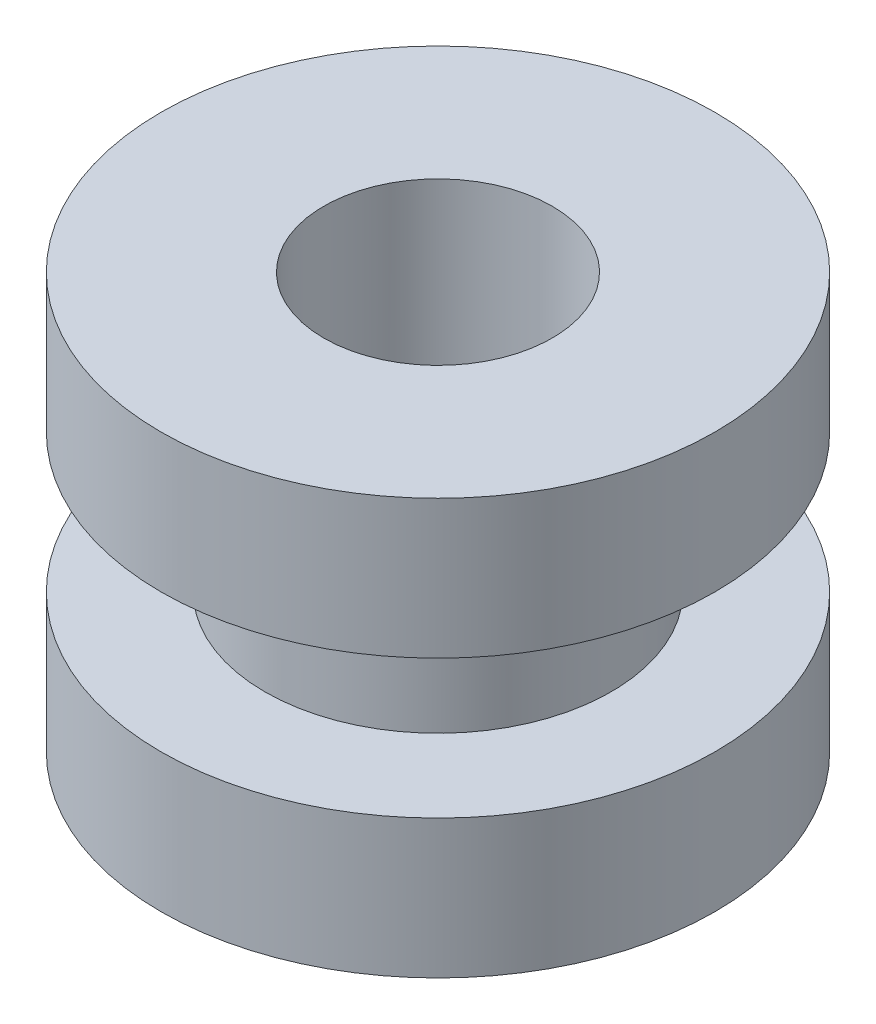
ISO-10303-21;
HEADER;
FILE_DESCRIPTION(('STEP AP214'),'2;1');
FILE_NAME('part.step','',(''),(''),'','','');
FILE_SCHEMA(('AUTOMOTIVE_DESIGN { 1 0 10303 214 1 1 1 1 }'));
ENDSEC;
DATA;
#1=APPLICATION_CONTEXT('core data for automotive mechanical design processes');
#2=APPLICATION_PROTOCOL_DEFINITION('international standard','automotive_design',2000,#1);
#3=PRODUCT_CONTEXT('',#1,'mechanical');
#4=PRODUCT('Part','Part','',(#3));
#5=PRODUCT_RELATED_PRODUCT_CATEGORY('part','',(#4));
#6=PRODUCT_DEFINITION_FORMATION('','',#4);
#7=PRODUCT_DEFINITION_CONTEXT('part definition',#1,'design');
#8=PRODUCT_DEFINITION('design','',#6,#7);
#9=PRODUCT_DEFINITION_SHAPE('','',#8);
#10=(LENGTH_UNIT() NAMED_UNIT(*) SI_UNIT(.MILLI.,.METRE.));
#11=(NAMED_UNIT(*) PLANE_ANGLE_UNIT() SI_UNIT($,.RADIAN.));
#12=(NAMED_UNIT(*) SI_UNIT($,.STERADIAN.) SOLID_ANGLE_UNIT());
#13=UNCERTAINTY_MEASURE_WITH_UNIT(LENGTH_MEASURE(1.E-05),#10,'distance_accuracy_value','');
#14=(GEOMETRIC_REPRESENTATION_CONTEXT(3) GLOBAL_UNCERTAINTY_ASSIGNED_CONTEXT((#13)) GLOBAL_UNIT_ASSIGNED_CONTEXT((#10,
#11,#12)) REPRESENTATION_CONTEXT('',''));
#15=CARTESIAN_POINT('',(0.,0.,0.));
#16=DIRECTION('',(0.,0.,1.));
#17=DIRECTION('',(1.,0.,0.));
#18=AXIS2_PLACEMENT_3D('',#15,#16,#17);
#19=CARTESIAN_POINT('',(0.,-6.,0.));
#20=DIRECTION('',(0.,-1.,0.));
#21=DIRECTION('',(0.,0.,-1.));
#22=AXIS2_PLACEMENT_3D('',#19,#20,#21);
#23=PLANE('',#22);
#24=CARTESIAN_POINT('',(0.,-6.,0.));
#25=DIRECTION('',(0.,-1.,0.));
#26=DIRECTION('',(0.,0.,-1.));
#27=AXIS2_PLACEMENT_3D('',#24,#25,#26);
#28=CIRCLE('',#27,6.3);
#29=CARTESIAN_POINT('',(0.,-6.,-6.3));
#30=VERTEX_POINT('',#29);
#31=EDGE_CURVE('E62',#30,#30,#28,.T.);
#32=ORIENTED_EDGE('',*,*,#31,.F.);
#33=EDGE_LOOP('',(#32));
#34=FACE_BOUND('',#33,.T.);
#35=CARTESIAN_POINT('',(0.,-6.,0.));
#36=DIRECTION('',(0.,1.,0.));
#37=DIRECTION('',(0.,0.,1.));
#38=AXIS2_PLACEMENT_3D('',#35,#36,#37);
#39=CIRCLE('',#38,8.);
#40=CARTESIAN_POINT('',(0.,-6.,8.));
#41=VERTEX_POINT('',#40);
#42=EDGE_CURVE('E10',#41,#41,#39,.T.);
#43=ORIENTED_EDGE('',*,*,#42,.F.);
#44=EDGE_LOOP('',(#43));
#45=FACE_BOUND('',#44,.T.);
#46=ADVANCED_FACE('F31',(#34,#45),#23,.T.);
#47=CARTESIAN_POINT('',(0.,0.,0.));
#48=DIRECTION('',(0.,1.,0.));
#49=DIRECTION('',(0.,0.,1.));
#50=AXIS2_PLACEMENT_3D('',#47,#48,#49);
#51=CYLINDRICAL_SURFACE('',#50,8.);
#52=ORIENTED_EDGE('',*,*,#42,.T.);
#53=EDGE_LOOP('',(#52));
#54=FACE_BOUND('',#53,.T.);
#55=CARTESIAN_POINT('',(0.,-2.,0.));
#56=DIRECTION('',(0.,1.,0.));
#57=DIRECTION('',(0.,0.,1.));
#58=AXIS2_PLACEMENT_3D('',#55,#56,#57);
#59=CIRCLE('',#58,8.);
#60=CARTESIAN_POINT('',(0.,-2.,8.));
#61=VERTEX_POINT('',#60);
#62=EDGE_CURVE('E37',#61,#61,#59,.T.);
#63=ORIENTED_EDGE('',*,*,#62,.F.);
#64=EDGE_LOOP('',(#63));
#65=FACE_BOUND('',#64,.T.);
#66=ADVANCED_FACE('F70',(#54,#65),#51,.T.);
#67=CARTESIAN_POINT('',(-8.,-2.,0.));
#68=DIRECTION('',(0.,1.,0.));
#69=DIRECTION('',(0.,0.,1.));
#70=AXIS2_PLACEMENT_3D('',#67,#68,#69);
#71=PLANE('',#70);
#72=ORIENTED_EDGE('',*,*,#62,.T.);
#73=EDGE_LOOP('',(#72));
#74=FACE_BOUND('',#73,.T.);
#75=CARTESIAN_POINT('',(0.,-2.,0.));
#76=DIRECTION('',(0.,1.,0.));
#77=DIRECTION('',(0.,0.,1.));
#78=AXIS2_PLACEMENT_3D('',#75,#76,#77);
#79=CIRCLE('',#78,5.);
#80=CARTESIAN_POINT('',(0.,-2.,5.));
#81=VERTEX_POINT('',#80);
#82=EDGE_CURVE('E41',#81,#81,#79,.T.);
#83=ORIENTED_EDGE('',*,*,#82,.F.);
#84=EDGE_LOOP('',(#83));
#85=FACE_BOUND('',#84,.T.);
#86=ADVANCED_FACE('F74',(#74,#85),#71,.T.);
#87=CARTESIAN_POINT('',(0.,0.,0.));
#88=DIRECTION('',(0.,1.,0.));
#89=DIRECTION('',(0.,0.,1.));
#90=AXIS2_PLACEMENT_3D('',#87,#88,#89);
#91=CYLINDRICAL_SURFACE('',#90,5.);
#92=ORIENTED_EDGE('',*,*,#82,.T.);
#93=EDGE_LOOP('',(#92));
#94=FACE_BOUND('',#93,.T.);
#95=CARTESIAN_POINT('',(0.,2.,0.));
#96=DIRECTION('',(0.,1.,0.));
#97=DIRECTION('',(0.,0.,1.));
#98=AXIS2_PLACEMENT_3D('',#95,#96,#97);
#99=CIRCLE('',#98,5.);
#100=CARTESIAN_POINT('',(0.,2.,5.));
#101=VERTEX_POINT('',#100);
#102=EDGE_CURVE('E53',#101,#101,#99,.T.);
#103=ORIENTED_EDGE('',*,*,#102,.F.);
#104=EDGE_LOOP('',(#103));
#105=FACE_BOUND('',#104,.T.);
#106=ADVANCED_FACE('F78',(#94,#105),#91,.T.);
#107=CARTESIAN_POINT('',(0.,6.,0.));
#108=DIRECTION('',(0.,1.,0.));
#109=DIRECTION('',(0.,0.,-1.));
#110=AXIS2_PLACEMENT_3D('',#107,#108,#109);
#111=PLANE('',#110);
#112=CARTESIAN_POINT('',(0.,6.,0.));
#113=DIRECTION('',(0.,1.,0.));
#114=DIRECTION('',(0.,0.,1.));
#115=AXIS2_PLACEMENT_3D('',#112,#113,#114);
#116=CIRCLE('',#115,3.3);
#117=CARTESIAN_POINT('',(0.,6.,3.3));
#118=VERTEX_POINT('',#117);
#119=EDGE_CURVE('E56',#118,#118,#116,.T.);
#120=ORIENTED_EDGE('',*,*,#119,.F.);
#121=EDGE_LOOP('',(#120));
#122=FACE_BOUND('',#121,.T.);
#123=CARTESIAN_POINT('',(0.,6.,0.));
#124=DIRECTION('',(0.,1.,0.));
#125=DIRECTION('',(0.,0.,1.));
#126=AXIS2_PLACEMENT_3D('',#123,#124,#125);
#127=CIRCLE('',#126,8.);
#128=CARTESIAN_POINT('',(0.,6.,8.));
#129=VERTEX_POINT('',#128);
#130=EDGE_CURVE('E45',#129,#129,#127,.T.);
#131=ORIENTED_EDGE('',*,*,#130,.T.);
#132=EDGE_LOOP('',(#131));
#133=FACE_BOUND('',#132,.T.);
#134=ADVANCED_FACE('F84',(#122,#133),#111,.T.);
#135=CARTESIAN_POINT('',(0.,0.,0.));
#136=DIRECTION('',(0.,-1.,0.));
#137=DIRECTION('',(0.,0.,1.));
#138=AXIS2_PLACEMENT_3D('',#135,#136,#137);
#139=CYLINDRICAL_SURFACE('',#138,8.);
#140=ORIENTED_EDGE('',*,*,#130,.F.);
#141=EDGE_LOOP('',(#140));
#142=FACE_BOUND('',#141,.T.);
#143=CARTESIAN_POINT('',(0.,2.,0.));
#144=DIRECTION('',(0.,1.,0.));
#145=DIRECTION('',(0.,0.,1.));
#146=AXIS2_PLACEMENT_3D('',#143,#144,#145);
#147=CIRCLE('',#146,8.);
#148=CARTESIAN_POINT('',(0.,2.,8.));
#149=VERTEX_POINT('',#148);
#150=EDGE_CURVE('E50',#149,#149,#147,.T.);
#151=ORIENTED_EDGE('',*,*,#150,.T.);
#152=EDGE_LOOP('',(#151));
#153=FACE_BOUND('',#152,.T.);
#154=ADVANCED_FACE('F88',(#142,#153),#139,.T.);
#155=CARTESIAN_POINT('',(-8.,2.,0.));
#156=DIRECTION('',(0.,-1.,0.));
#157=DIRECTION('',(0.,0.,1.));
#158=AXIS2_PLACEMENT_3D('',#155,#156,#157);
#159=PLANE('',#158);
#160=ORIENTED_EDGE('',*,*,#150,.F.);
#161=EDGE_LOOP('',(#160));
#162=FACE_BOUND('',#161,.T.);
#163=ORIENTED_EDGE('',*,*,#102,.T.);
#164=EDGE_LOOP('',(#163));
#165=FACE_BOUND('',#164,.T.);
#166=ADVANCED_FACE('F92',(#162,#165),#159,.T.);
#167=CARTESIAN_POINT('',(0.,-6.,0.));
#168=DIRECTION('',(0.,-1.,0.));
#169=DIRECTION('',(0.,0.,-1.));
#170=AXIS2_PLACEMENT_3D('',#167,#168,#169);
#171=CYLINDRICAL_SURFACE('',#170,3.3);
#172=CARTESIAN_POINT('',(0.,-3.,0.));
#173=DIRECTION('',(0.,-1.,0.));
#174=DIRECTION('',(0.,0.,-1.));
#175=AXIS2_PLACEMENT_3D('',#172,#173,#174);
#176=CIRCLE('',#175,3.3);
#177=CARTESIAN_POINT('',(0.,-3.,-3.3));
#178=VERTEX_POINT('',#177);
#179=EDGE_CURVE('E59',#178,#178,#176,.T.);
#180=ORIENTED_EDGE('',*,*,#179,.T.);
#181=EDGE_LOOP('',(#180));
#182=FACE_BOUND('',#181,.T.);
#183=ORIENTED_EDGE('',*,*,#119,.T.);
#184=EDGE_LOOP('',(#183));
#185=FACE_BOUND('',#184,.T.);
#186=ADVANCED_FACE('F96',(#182,#185),#171,.F.);
#187=CARTESIAN_POINT('',(0.,-6.,0.));
#188=DIRECTION('',(0.,-1.,0.));
#189=DIRECTION('',(0.,0.,-1.));
#190=AXIS2_PLACEMENT_3D('',#187,#188,#189);
#191=CONICAL_SURFACE('',#190,6.3,0.785398163397448);
#192=ORIENTED_EDGE('',*,*,#179,.F.);
#193=EDGE_LOOP('',(#192));
#194=FACE_BOUND('',#193,.T.);
#195=ORIENTED_EDGE('',*,*,#31,.T.);
#196=EDGE_LOOP('',(#195));
#197=FACE_BOUND('',#196,.T.);
#198=ADVANCED_FACE('F66',(#194,#197),#191,.F.);
#199=CLOSED_SHELL('',(#46,#66,#86,#106,#134,#154,#166,#186,#198));
#200=MANIFOLD_SOLID_BREP('B2',#199);
#201=ADVANCED_BREP_SHAPE_REPRESENTATION('',(#18,#200),#14);
#202=SHAPE_DEFINITION_REPRESENTATION(#9,#201);
ENDSEC;
END-ISO-10303-21;
